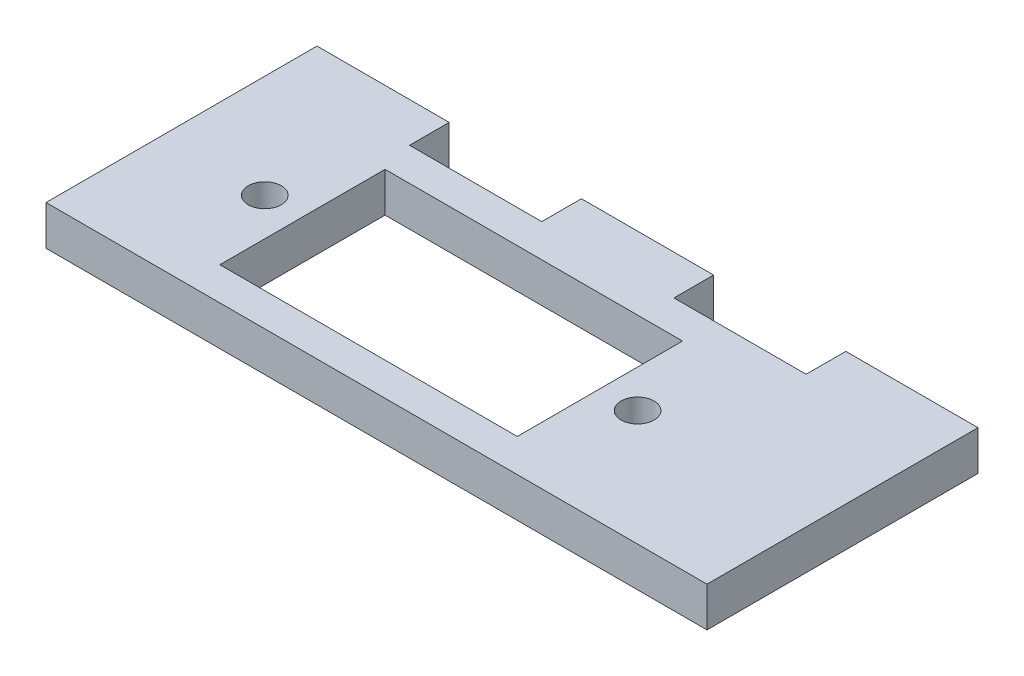
ISO-10303-21;
HEADER;
FILE_DESCRIPTION(('STEP AP214'),'2;1');
FILE_NAME('part.step','',(''),(''),'','','');
FILE_SCHEMA(('AUTOMOTIVE_DESIGN { 1 0 10303 214 1 1 1 1 }'));
ENDSEC;
DATA;
#1=APPLICATION_CONTEXT('core data for automotive mechanical design processes');
#2=APPLICATION_PROTOCOL_DEFINITION('international standard','automotive_design',2000,#1);
#3=PRODUCT_CONTEXT('',#1,'mechanical');
#4=PRODUCT('Part','Part','',(#3));
#5=PRODUCT_RELATED_PRODUCT_CATEGORY('part','',(#4));
#6=PRODUCT_DEFINITION_FORMATION('','',#4);
#7=PRODUCT_DEFINITION_CONTEXT('part definition',#1,'design');
#8=PRODUCT_DEFINITION('design','',#6,#7);
#9=PRODUCT_DEFINITION_SHAPE('','',#8);
#10=(LENGTH_UNIT() NAMED_UNIT(*) SI_UNIT(.MILLI.,.METRE.));
#11=(NAMED_UNIT(*) PLANE_ANGLE_UNIT() SI_UNIT($,.RADIAN.));
#12=(NAMED_UNIT(*) SI_UNIT($,.STERADIAN.) SOLID_ANGLE_UNIT());
#13=UNCERTAINTY_MEASURE_WITH_UNIT(LENGTH_MEASURE(1.E-05),#10,'distance_accuracy_value','');
#14=(GEOMETRIC_REPRESENTATION_CONTEXT(3) GLOBAL_UNCERTAINTY_ASSIGNED_CONTEXT((#13)) GLOBAL_UNIT_ASSIGNED_CONTEXT((#10,
#11,#12)) REPRESENTATION_CONTEXT('',''));
#15=CARTESIAN_POINT('',(0.,0.,0.));
#16=DIRECTION('',(0.,0.,1.));
#17=DIRECTION('',(1.,0.,0.));
#18=AXIS2_PLACEMENT_3D('',#15,#16,#17);
#19=CARTESIAN_POINT('',(8.14999999999999,3.,0.));
#20=DIRECTION('',(1.,0.,0.));
#21=DIRECTION('',(0.,0.,-1.));
#22=AXIS2_PLACEMENT_3D('',#19,#20,#21);
#23=PLANE('',#22);
#24=DIRECTION('',(0.,0.,1.));
#25=VECTOR('',#24,1.);
#26=CARTESIAN_POINT('',(8.14999999999999,0.,0.));
#27=LINE('',#26,#25);
#28=CARTESIAN_POINT('',(8.14999999999999,0.,-6.25));
#29=VERTEX_POINT('',#28);
#30=CARTESIAN_POINT('',(8.14999999999999,0.,6.25));
#31=VERTEX_POINT('',#30);
#32=EDGE_CURVE('E277',#29,#31,#27,.T.);
#33=ORIENTED_EDGE('',*,*,#32,.T.);
#34=DIRECTION('',(0.,-1.,0.));
#35=VECTOR('',#34,1.);
#36=CARTESIAN_POINT('',(8.14999999999999,3.,6.25));
#37=LINE('',#36,#35);
#38=CARTESIAN_POINT('',(8.14999999999999,3.,6.25));
#39=VERTEX_POINT('',#38);
#40=EDGE_CURVE('E257',#39,#31,#37,.T.);
#41=ORIENTED_EDGE('',*,*,#40,.F.);
#42=DIRECTION('',(0.,0.,1.));
#43=VECTOR('',#42,1.);
#44=CARTESIAN_POINT('',(8.14999999999999,3.,0.));
#45=LINE('',#44,#43);
#46=CARTESIAN_POINT('',(8.14999999999999,3.,-6.25));
#47=VERTEX_POINT('',#46);
#48=EDGE_CURVE('E323',#47,#39,#45,.T.);
#49=ORIENTED_EDGE('',*,*,#48,.F.);
#50=DIRECTION('',(0.,-1.,0.));
#51=VECTOR('',#50,1.);
#52=CARTESIAN_POINT('',(8.14999999999999,3.,-6.25));
#53=LINE('',#52,#51);
#54=EDGE_CURVE('E228',#47,#29,#53,.T.);
#55=ORIENTED_EDGE('',*,*,#54,.T.);
#56=EDGE_LOOP('',(#33,#41,#49,#55));
#57=FACE_BOUND('',#56,.T.);
#58=ADVANCED_FACE('F117',(#57),#23,.F.);
#59=CARTESIAN_POINT('',(0.,3.,6.25));
#60=DIRECTION('',(0.,0.,-1.));
#61=DIRECTION('',(-1.,0.,0.));
#62=AXIS2_PLACEMENT_3D('',#59,#60,#61);
#63=PLANE('',#62);
#64=DIRECTION('',(1.,0.,0.));
#65=VECTOR('',#64,1.);
#66=CARTESIAN_POINT('',(0.,0.,6.25));
#67=LINE('',#66,#65);
#68=CARTESIAN_POINT('',(-14.35,0.,6.25));
#69=VERTEX_POINT('',#68);
#70=EDGE_CURVE('E273',#69,#31,#67,.T.);
#71=ORIENTED_EDGE('',*,*,#70,.F.);
#72=DIRECTION('',(0.,-1.,0.));
#73=VECTOR('',#72,1.);
#74=CARTESIAN_POINT('',(-14.35,3.,6.25));
#75=LINE('',#74,#73);
#76=CARTESIAN_POINT('',(-14.35,3.,6.25));
#77=VERTEX_POINT('',#76);
#78=EDGE_CURVE('E261',#77,#69,#75,.T.);
#79=ORIENTED_EDGE('',*,*,#78,.F.);
#80=DIRECTION('',(1.,0.,0.));
#81=VECTOR('',#80,1.);
#82=CARTESIAN_POINT('',(0.,3.,6.25));
#83=LINE('',#82,#81);
#84=EDGE_CURVE('E319',#77,#39,#83,.T.);
#85=ORIENTED_EDGE('',*,*,#84,.T.);
#86=ORIENTED_EDGE('',*,*,#40,.T.);
#87=EDGE_LOOP('',(#71,#79,#85,#86));
#88=FACE_BOUND('',#87,.T.);
#89=ADVANCED_FACE('F487',(#88),#63,.T.);
#90=CARTESIAN_POINT('',(-14.35,3.,0.));
#91=DIRECTION('',(1.,0.,0.));
#92=DIRECTION('',(0.,0.,-1.));
#93=AXIS2_PLACEMENT_3D('',#90,#91,#92);
#94=PLANE('',#93);
#95=DIRECTION('',(0.,0.,1.));
#96=VECTOR('',#95,1.);
#97=CARTESIAN_POINT('',(-14.35,0.,0.));
#98=LINE('',#97,#96);
#99=CARTESIAN_POINT('',(-14.35,0.,-6.25));
#100=VERTEX_POINT('',#99);
#101=EDGE_CURVE('E268',#100,#69,#98,.T.);
#102=ORIENTED_EDGE('',*,*,#101,.F.);
#103=DIRECTION('',(0.,-1.,0.));
#104=VECTOR('',#103,1.);
#105=CARTESIAN_POINT('',(-14.35,3.,-6.25));
#106=LINE('',#105,#104);
#107=CARTESIAN_POINT('',(-14.35,3.,-6.25));
#108=VERTEX_POINT('',#107);
#109=EDGE_CURVE('E232',#108,#100,#106,.T.);
#110=ORIENTED_EDGE('',*,*,#109,.F.);
#111=DIRECTION('',(0.,0.,1.));
#112=VECTOR('',#111,1.);
#113=CARTESIAN_POINT('',(-14.35,3.,0.));
#114=LINE('',#113,#112);
#115=EDGE_CURVE('E253',#108,#77,#114,.T.);
#116=ORIENTED_EDGE('',*,*,#115,.T.);
#117=ORIENTED_EDGE('',*,*,#78,.T.);
#118=EDGE_LOOP('',(#102,#110,#116,#117));
#119=FACE_BOUND('',#118,.T.);
#120=ADVANCED_FACE('F492',(#119),#94,.T.);
#121=CARTESIAN_POINT('',(0.,3.,-6.25));
#122=DIRECTION('',(0.,0.,-1.));
#123=DIRECTION('',(-1.,0.,0.));
#124=AXIS2_PLACEMENT_3D('',#121,#122,#123);
#125=PLANE('',#124);
#126=DIRECTION('',(1.,0.,0.));
#127=VECTOR('',#126,1.);
#128=CARTESIAN_POINT('',(0.,0.,-6.25));
#129=LINE('',#128,#127);
#130=EDGE_CURVE('E281',#100,#29,#129,.T.);
#131=ORIENTED_EDGE('',*,*,#130,.T.);
#132=ORIENTED_EDGE('',*,*,#54,.F.);
#133=DIRECTION('',(1.,0.,0.));
#134=VECTOR('',#133,1.);
#135=CARTESIAN_POINT('',(0.,3.,-6.25));
#136=LINE('',#135,#134);
#137=EDGE_CURVE('E327',#108,#47,#136,.T.);
#138=ORIENTED_EDGE('',*,*,#137,.F.);
#139=ORIENTED_EDGE('',*,*,#109,.T.);
#140=EDGE_LOOP('',(#131,#132,#138,#139));
#141=FACE_BOUND('',#140,.T.);
#142=ADVANCED_FACE('F392',(#141),#125,.F.);
#143=CARTESIAN_POINT('',(25.,3.,0.));
#144=DIRECTION('',(-1.,0.,0.));
#145=DIRECTION('',(0.,0.,1.));
#146=AXIS2_PLACEMENT_3D('',#143,#144,#145);
#147=PLANE('',#146);
#148=DIRECTION('',(0.,0.,-1.));
#149=VECTOR('',#148,1.);
#150=CARTESIAN_POINT('',(25.,0.,0.));
#151=LINE('',#150,#149);
#152=CARTESIAN_POINT('',(25.,0.,8.75));
#153=VERTEX_POINT('',#152);
#154=CARTESIAN_POINT('',(25.,0.,-11.75));
#155=VERTEX_POINT('',#154);
#156=EDGE_CURVE('E166',#153,#155,#151,.T.);
#157=ORIENTED_EDGE('',*,*,#156,.T.);
#158=DIRECTION('',(0.,-1.,0.));
#159=VECTOR('',#158,1.);
#160=CARTESIAN_POINT('',(25.,3.,-11.75));
#161=LINE('',#160,#159);
#162=CARTESIAN_POINT('',(25.,3.,-11.75));
#163=VERTEX_POINT('',#162);
#164=EDGE_CURVE('E121',#163,#155,#161,.T.);
#165=ORIENTED_EDGE('',*,*,#164,.F.);
#166=DIRECTION('',(0.,0.,-1.));
#167=VECTOR('',#166,1.);
#168=CARTESIAN_POINT('',(25.,3.,0.));
#169=LINE('',#168,#167);
#170=CARTESIAN_POINT('',(25.,3.,8.75));
#171=VERTEX_POINT('',#170);
#172=EDGE_CURVE('E351',#171,#163,#169,.T.);
#173=ORIENTED_EDGE('',*,*,#172,.F.);
#174=DIRECTION('',(0.,-1.,0.));
#175=VECTOR('',#174,1.);
#176=CARTESIAN_POINT('',(25.,3.,8.75));
#177=LINE('',#176,#175);
#178=EDGE_CURVE('E229',#171,#153,#177,.T.);
#179=ORIENTED_EDGE('',*,*,#178,.T.);
#180=EDGE_LOOP('',(#157,#165,#173,#179));
#181=FACE_BOUND('',#180,.T.);
#182=ADVANCED_FACE('F418',(#181),#147,.F.);
#183=CARTESIAN_POINT('',(0.,3.,-8.75));
#184=DIRECTION('',(0.,0.,-1.));
#185=DIRECTION('',(-1.,0.,0.));
#186=AXIS2_PLACEMENT_3D('',#183,#184,#185);
#187=PLANE('',#186);
#188=DIRECTION('',(0.,1.,0.));
#189=VECTOR('',#188,1.);
#190=CARTESIAN_POINT('',(15.,3.,-8.75));
#191=LINE('',#190,#189);
#192=CARTESIAN_POINT('',(15.,0.,-8.75));
#193=VERTEX_POINT('',#192);
#194=CARTESIAN_POINT('',(15.,3.,-8.75));
#195=VERTEX_POINT('',#194);
#196=EDGE_CURVE('E12',#193,#195,#191,.T.);
#197=ORIENTED_EDGE('',*,*,#196,.F.);
#198=DIRECTION('',(1.,0.,0.));
#199=VECTOR('',#198,1.);
#200=CARTESIAN_POINT('',(0.,0.,-8.75));
#201=LINE('',#200,#199);
#202=CARTESIAN_POINT('',(5.00000000000001,0.,-8.75));
#203=VERTEX_POINT('',#202);
#204=EDGE_CURVE('E194',#203,#193,#201,.T.);
#205=ORIENTED_EDGE('',*,*,#204,.F.);
#206=DIRECTION('',(0.,-1.,0.));
#207=VECTOR('',#206,1.);
#208=CARTESIAN_POINT('',(5.00000000000001,3.,-8.75));
#209=LINE('',#208,#207);
#210=CARTESIAN_POINT('',(5.00000000000001,3.,-8.75));
#211=VERTEX_POINT('',#210);
#212=EDGE_CURVE('E233',#211,#203,#209,.T.);
#213=ORIENTED_EDGE('',*,*,#212,.F.);
#214=DIRECTION('',(1.,0.,0.));
#215=VECTOR('',#214,1.);
#216=CARTESIAN_POINT('',(0.,3.,-8.75));
#217=LINE('',#216,#215);
#218=EDGE_CURVE('E347',#211,#195,#217,.T.);
#219=ORIENTED_EDGE('',*,*,#218,.T.);
#220=EDGE_LOOP('',(#197,#205,#213,#219));
#221=FACE_BOUND('',#220,.T.);
#222=ADVANCED_FACE('F412',(#221),#187,.T.);
#223=CARTESIAN_POINT('',(5.,3.,0.));
#224=DIRECTION('',(-1.,0.,0.));
#225=DIRECTION('',(0.,0.,1.));
#226=AXIS2_PLACEMENT_3D('',#223,#224,#225);
#227=PLANE('',#226);
#228=DIRECTION('',(0.,0.,-1.));
#229=VECTOR('',#228,1.);
#230=CARTESIAN_POINT('',(5.,0.,0.));
#231=LINE('',#230,#229);
#232=CARTESIAN_POINT('',(5.00000000000001,0.,-11.75));
#233=VERTEX_POINT('',#232);
#234=EDGE_CURVE('E297',#203,#233,#231,.T.);
#235=ORIENTED_EDGE('',*,*,#234,.T.);
#236=DIRECTION('',(0.,-1.,0.));
#237=VECTOR('',#236,1.);
#238=CARTESIAN_POINT('',(5.00000000000001,3.,-11.75));
#239=LINE('',#238,#237);
#240=CARTESIAN_POINT('',(5.00000000000001,3.,-11.75));
#241=VERTEX_POINT('',#240);
#242=EDGE_CURVE('E237',#241,#233,#239,.T.);
#243=ORIENTED_EDGE('',*,*,#242,.F.);
#244=DIRECTION('',(0.,0.,-1.));
#245=VECTOR('',#244,1.);
#246=CARTESIAN_POINT('',(5.,3.,0.));
#247=LINE('',#246,#245);
#248=EDGE_CURVE('E343',#211,#241,#247,.T.);
#249=ORIENTED_EDGE('',*,*,#248,.F.);
#250=ORIENTED_EDGE('',*,*,#212,.T.);
#251=EDGE_LOOP('',(#235,#243,#249,#250));
#252=FACE_BOUND('',#251,.T.);
#253=ADVANCED_FACE('F460',(#252),#227,.F.);
#254=CARTESIAN_POINT('',(0.,3.,-11.75));
#255=DIRECTION('',(0.,0.,-1.));
#256=DIRECTION('',(-1.,0.,0.));
#257=AXIS2_PLACEMENT_3D('',#254,#255,#256);
#258=PLANE('',#257);
#259=DIRECTION('',(1.,0.,0.));
#260=VECTOR('',#259,1.);
#261=CARTESIAN_POINT('',(0.,0.,-11.75));
#262=LINE('',#261,#260);
#263=CARTESIAN_POINT('',(-4.99999999999999,0.,-11.75));
#264=VERTEX_POINT('',#263);
#265=EDGE_CURVE('E293',#264,#233,#262,.T.);
#266=ORIENTED_EDGE('',*,*,#265,.F.);
#267=DIRECTION('',(0.,-1.,0.));
#268=VECTOR('',#267,1.);
#269=CARTESIAN_POINT('',(-4.99999999999999,3.,-11.75));
#270=LINE('',#269,#268);
#271=CARTESIAN_POINT('',(-4.99999999999999,3.,-11.75));
#272=VERTEX_POINT('',#271);
#273=EDGE_CURVE('E241',#272,#264,#270,.T.);
#274=ORIENTED_EDGE('',*,*,#273,.F.);
#275=DIRECTION('',(1.,0.,0.));
#276=VECTOR('',#275,1.);
#277=CARTESIAN_POINT('',(0.,3.,-11.75));
#278=LINE('',#277,#276);
#279=EDGE_CURVE('E339',#272,#241,#278,.T.);
#280=ORIENTED_EDGE('',*,*,#279,.T.);
#281=ORIENTED_EDGE('',*,*,#242,.T.);
#282=EDGE_LOOP('',(#266,#274,#280,#281));
#283=FACE_BOUND('',#282,.T.);
#284=ADVANCED_FACE('F439',(#283),#258,.T.);
#285=CARTESIAN_POINT('',(-4.99999999999999,3.,0.));
#286=DIRECTION('',(-1.,0.,0.));
#287=DIRECTION('',(0.,0.,1.));
#288=AXIS2_PLACEMENT_3D('',#285,#286,#287);
#289=PLANE('',#288);
#290=DIRECTION('',(0.,0.,-1.));
#291=VECTOR('',#290,1.);
#292=CARTESIAN_POINT('',(-4.99999999999999,0.,0.));
#293=LINE('',#292,#291);
#294=CARTESIAN_POINT('',(-4.99999999999999,0.,-8.75));
#295=VERTEX_POINT('',#294);
#296=EDGE_CURVE('E289',#295,#264,#293,.T.);
#297=ORIENTED_EDGE('',*,*,#296,.F.);
#298=DIRECTION('',(0.,-1.,0.));
#299=VECTOR('',#298,1.);
#300=CARTESIAN_POINT('',(-4.99999999999999,3.,-8.75));
#301=LINE('',#300,#299);
#302=CARTESIAN_POINT('',(-4.99999999999999,3.,-8.75));
#303=VERTEX_POINT('',#302);
#304=EDGE_CURVE('E245',#303,#295,#301,.T.);
#305=ORIENTED_EDGE('',*,*,#304,.F.);
#306=DIRECTION('',(0.,0.,-1.));
#307=VECTOR('',#306,1.);
#308=CARTESIAN_POINT('',(-4.99999999999999,3.,0.));
#309=LINE('',#308,#307);
#310=EDGE_CURVE('E335',#303,#272,#309,.T.);
#311=ORIENTED_EDGE('',*,*,#310,.T.);
#312=ORIENTED_EDGE('',*,*,#273,.T.);
#313=EDGE_LOOP('',(#297,#305,#311,#312));
#314=FACE_BOUND('',#313,.T.);
#315=ADVANCED_FACE('F431',(#314),#289,.T.);
#316=CARTESIAN_POINT('',(-15.,0.,-8.75));
#317=VERTEX_POINT('',#316);
#318=EDGE_CURVE('E288',#317,#295,#201,.T.);
#319=ORIENTED_EDGE('',*,*,#318,.F.);
#320=DIRECTION('',(0.,1.,0.));
#321=VECTOR('',#320,1.);
#322=CARTESIAN_POINT('',(-15.,3.,-8.75));
#323=LINE('',#322,#321);
#324=CARTESIAN_POINT('',(-15.,3.,-8.75));
#325=VERTEX_POINT('',#324);
#326=EDGE_CURVE('E128',#317,#325,#323,.T.);
#327=ORIENTED_EDGE('',*,*,#326,.T.);
#328=EDGE_CURVE('E334',#325,#303,#217,.T.);
#329=ORIENTED_EDGE('',*,*,#328,.T.);
#330=ORIENTED_EDGE('',*,*,#304,.T.);
#331=EDGE_LOOP('',(#319,#327,#329,#330));
#332=FACE_BOUND('',#331,.T.);
#333=ADVANCED_FACE('F426',(#332),#187,.T.);
#334=CARTESIAN_POINT('',(-25.,3.,0.));
#335=DIRECTION('',(-1.,0.,0.));
#336=DIRECTION('',(0.,0.,1.));
#337=AXIS2_PLACEMENT_3D('',#334,#335,#336);
#338=PLANE('',#337);
#339=DIRECTION('',(0.,0.,-1.));
#340=VECTOR('',#339,1.);
#341=CARTESIAN_POINT('',(-25.,0.,0.));
#342=LINE('',#341,#340);
#343=CARTESIAN_POINT('',(-25.,0.,8.75));
#344=VERTEX_POINT('',#343);
#345=CARTESIAN_POINT('',(-25.,0.,-11.75));
#346=VERTEX_POINT('',#345);
#347=EDGE_CURVE('E285',#344,#346,#342,.T.);
#348=ORIENTED_EDGE('',*,*,#347,.F.);
#349=DIRECTION('',(0.,-1.,0.));
#350=VECTOR('',#349,1.);
#351=CARTESIAN_POINT('',(-25.,3.,8.75));
#352=LINE('',#351,#350);
#353=CARTESIAN_POINT('',(-25.,3.,8.75));
#354=VERTEX_POINT('',#353);
#355=EDGE_CURVE('E249',#354,#344,#352,.T.);
#356=ORIENTED_EDGE('',*,*,#355,.F.);
#357=DIRECTION('',(0.,0.,-1.));
#358=VECTOR('',#357,1.);
#359=CARTESIAN_POINT('',(-25.,3.,0.));
#360=LINE('',#359,#358);
#361=CARTESIAN_POINT('',(-25.,3.,-11.75));
#362=VERTEX_POINT('',#361);
#363=EDGE_CURVE('E331',#354,#362,#360,.T.);
#364=ORIENTED_EDGE('',*,*,#363,.T.);
#365=DIRECTION('',(0.,-1.,0.));
#366=VECTOR('',#365,1.);
#367=CARTESIAN_POINT('',(-25.,3.,-11.75));
#368=LINE('',#367,#366);
#369=EDGE_CURVE('E206',#362,#346,#368,.T.);
#370=ORIENTED_EDGE('',*,*,#369,.T.);
#371=EDGE_LOOP('',(#348,#356,#364,#370));
#372=FACE_BOUND('',#371,.T.);
#373=ADVANCED_FACE('F472',(#372),#338,.T.);
#374=CARTESIAN_POINT('',(0.,3.,8.75));
#375=DIRECTION('',(0.,0.,-1.));
#376=DIRECTION('',(-1.,0.,0.));
#377=AXIS2_PLACEMENT_3D('',#374,#375,#376);
#378=PLANE('',#377);
#379=DIRECTION('',(1.,0.,0.));
#380=VECTOR('',#379,1.);
#381=CARTESIAN_POINT('',(0.,0.,8.75));
#382=LINE('',#381,#380);
#383=EDGE_CURVE('E305',#344,#153,#382,.T.);
#384=ORIENTED_EDGE('',*,*,#383,.T.);
#385=ORIENTED_EDGE('',*,*,#178,.F.);
#386=DIRECTION('',(1.,0.,0.));
#387=VECTOR('',#386,1.);
#388=CARTESIAN_POINT('',(0.,3.,8.75));
#389=LINE('',#388,#387);
#390=EDGE_CURVE('E354',#354,#171,#389,.T.);
#391=ORIENTED_EDGE('',*,*,#390,.F.);
#392=ORIENTED_EDGE('',*,*,#355,.T.);
#393=EDGE_LOOP('',(#384,#385,#391,#392));
#394=FACE_BOUND('',#393,.T.);
#395=ADVANCED_FACE('F474',(#394),#378,.F.);
#396=CARTESIAN_POINT('',(11.,3.,0.));
#397=DIRECTION('',(0.,-1.,0.));
#398=DIRECTION('',(0.,0.,-1.));
#399=AXIS2_PLACEMENT_3D('',#396,#397,#398);
#400=CYLINDRICAL_SURFACE('',#399,1.25);
#401=CARTESIAN_POINT('',(11.,3.,0.));
#402=DIRECTION('',(0.,1.,0.));
#403=DIRECTION('',(0.,0.,1.));
#404=AXIS2_PLACEMENT_3D('',#401,#402,#403);
#405=CIRCLE('',#404,1.25);
#406=CARTESIAN_POINT('',(11.,3.,1.25));
#407=VERTEX_POINT('',#406);
#408=EDGE_CURVE('E358',#407,#407,#405,.T.);
#409=ORIENTED_EDGE('',*,*,#408,.T.);
#410=EDGE_LOOP('',(#409));
#411=FACE_BOUND('',#410,.T.);
#412=CARTESIAN_POINT('',(11.,0.,0.));
#413=DIRECTION('',(0.,1.,0.));
#414=DIRECTION('',(0.,0.,1.));
#415=AXIS2_PLACEMENT_3D('',#412,#413,#414);
#416=CIRCLE('',#415,1.25);
#417=CARTESIAN_POINT('',(11.,0.,1.25));
#418=VERTEX_POINT('',#417);
#419=EDGE_CURVE('E309',#418,#418,#416,.T.);
#420=ORIENTED_EDGE('',*,*,#419,.F.);
#421=EDGE_LOOP('',(#420));
#422=FACE_BOUND('',#421,.T.);
#423=ADVANCED_FACE('F476',(#411,#422),#400,.F.);
#424=CARTESIAN_POINT('',(-17.2,3.,0.));
#425=DIRECTION('',(0.,-1.,0.));
#426=DIRECTION('',(0.,0.,-1.));
#427=AXIS2_PLACEMENT_3D('',#424,#425,#426);
#428=CYLINDRICAL_SURFACE('',#427,1.25);
#429=CARTESIAN_POINT('',(-17.2,3.,0.));
#430=DIRECTION('',(0.,1.,0.));
#431=DIRECTION('',(0.,0.,1.));
#432=AXIS2_PLACEMENT_3D('',#429,#430,#431);
#433=CIRCLE('',#432,1.25);
#434=CARTESIAN_POINT('',(-17.2,3.,1.25));
#435=VERTEX_POINT('',#434);
#436=EDGE_CURVE('E272',#435,#435,#433,.T.);
#437=ORIENTED_EDGE('',*,*,#436,.T.);
#438=EDGE_LOOP('',(#437));
#439=FACE_BOUND('',#438,.T.);
#440=CARTESIAN_POINT('',(-17.2,0.,0.));
#441=DIRECTION('',(0.,1.,0.));
#442=DIRECTION('',(0.,0.,1.));
#443=AXIS2_PLACEMENT_3D('',#440,#441,#442);
#444=CIRCLE('',#443,1.25);
#445=CARTESIAN_POINT('',(-17.2,0.,1.25));
#446=VERTEX_POINT('',#445);
#447=EDGE_CURVE('E211',#446,#446,#444,.T.);
#448=ORIENTED_EDGE('',*,*,#447,.F.);
#449=EDGE_LOOP('',(#448));
#450=FACE_BOUND('',#449,.T.);
#451=ADVANCED_FACE('F366',(#439,#450),#428,.F.);
#452=CARTESIAN_POINT('',(0.,0.,0.));
#453=DIRECTION('',(0.,1.,0.));
#454=DIRECTION('',(0.,0.,1.));
#455=AXIS2_PLACEMENT_3D('',#452,#453,#454);
#456=PLANE('',#455);
#457=ORIENTED_EDGE('',*,*,#447,.T.);
#458=EDGE_LOOP('',(#457));
#459=FACE_BOUND('',#458,.T.);
#460=ORIENTED_EDGE('',*,*,#419,.T.);
#461=EDGE_LOOP('',(#460));
#462=FACE_BOUND('',#461,.T.);
#463=ORIENTED_EDGE('',*,*,#383,.F.);
#464=ORIENTED_EDGE('',*,*,#347,.T.);
#465=DIRECTION('',(1.,0.,0.));
#466=VECTOR('',#465,1.);
#467=CARTESIAN_POINT('',(-25.,0.,-11.75));
#468=LINE('',#467,#466);
#469=CARTESIAN_POINT('',(-15.,0.,-11.75));
#470=VERTEX_POINT('',#469);
#471=EDGE_CURVE('E217',#346,#470,#468,.T.);
#472=ORIENTED_EDGE('',*,*,#471,.T.);
#473=DIRECTION('',(0.,0.,-1.));
#474=VECTOR('',#473,1.);
#475=CARTESIAN_POINT('',(-15.,0.,-8.75));
#476=LINE('',#475,#474);
#477=EDGE_CURVE('E212',#317,#470,#476,.T.);
#478=ORIENTED_EDGE('',*,*,#477,.F.);
#479=ORIENTED_EDGE('',*,*,#318,.T.);
#480=ORIENTED_EDGE('',*,*,#296,.T.);
#481=ORIENTED_EDGE('',*,*,#265,.T.);
#482=ORIENTED_EDGE('',*,*,#234,.F.);
#483=ORIENTED_EDGE('',*,*,#204,.T.);
#484=DIRECTION('',(0.,0.,-1.));
#485=VECTOR('',#484,1.);
#486=CARTESIAN_POINT('',(15.,0.,-8.75));
#487=LINE('',#486,#485);
#488=CARTESIAN_POINT('',(15.,0.,-11.75));
#489=VERTEX_POINT('',#488);
#490=EDGE_CURVE('E176',#193,#489,#487,.T.);
#491=ORIENTED_EDGE('',*,*,#490,.T.);
#492=DIRECTION('',(1.,0.,0.));
#493=VECTOR('',#492,1.);
#494=CARTESIAN_POINT('',(15.,0.,-11.75));
#495=LINE('',#494,#493);
#496=EDGE_CURVE('E185',#489,#155,#495,.T.);
#497=ORIENTED_EDGE('',*,*,#496,.T.);
#498=ORIENTED_EDGE('',*,*,#156,.F.);
#499=EDGE_LOOP('',(#463,#464,#472,#478,#479,#480,#481,#482,#483,#491,#497,#498));
#500=FACE_BOUND('',#499,.T.);
#501=ORIENTED_EDGE('',*,*,#130,.F.);
#502=ORIENTED_EDGE('',*,*,#101,.T.);
#503=ORIENTED_EDGE('',*,*,#70,.T.);
#504=ORIENTED_EDGE('',*,*,#32,.F.);
#505=EDGE_LOOP('',(#501,#502,#503,#504));
#506=FACE_BOUND('',#505,.T.);
#507=ADVANCED_FACE('F190',(#459,#462,#500,#506),#456,.F.);
#508=CARTESIAN_POINT('',(0.,3.,0.));
#509=DIRECTION('',(0.,1.,0.));
#510=DIRECTION('',(0.,0.,1.));
#511=AXIS2_PLACEMENT_3D('',#508,#509,#510);
#512=PLANE('',#511);
#513=ORIENTED_EDGE('',*,*,#436,.F.);
#514=EDGE_LOOP('',(#513));
#515=FACE_BOUND('',#514,.T.);
#516=ORIENTED_EDGE('',*,*,#408,.F.);
#517=EDGE_LOOP('',(#516));
#518=FACE_BOUND('',#517,.T.);
#519=ORIENTED_EDGE('',*,*,#390,.T.);
#520=ORIENTED_EDGE('',*,*,#172,.T.);
#521=DIRECTION('',(1.,0.,0.));
#522=VECTOR('',#521,1.);
#523=CARTESIAN_POINT('',(15.,3.,-11.75));
#524=LINE('',#523,#522);
#525=CARTESIAN_POINT('',(15.,3.,-11.75));
#526=VERTEX_POINT('',#525);
#527=EDGE_CURVE('E196',#526,#163,#524,.T.);
#528=ORIENTED_EDGE('',*,*,#527,.F.);
#529=DIRECTION('',(0.,0.,-1.));
#530=VECTOR('',#529,1.);
#531=CARTESIAN_POINT('',(15.,3.,-8.75));
#532=LINE('',#531,#530);
#533=EDGE_CURVE('E179',#195,#526,#532,.T.);
#534=ORIENTED_EDGE('',*,*,#533,.F.);
#535=ORIENTED_EDGE('',*,*,#218,.F.);
#536=ORIENTED_EDGE('',*,*,#248,.T.);
#537=ORIENTED_EDGE('',*,*,#279,.F.);
#538=ORIENTED_EDGE('',*,*,#310,.F.);
#539=ORIENTED_EDGE('',*,*,#328,.F.);
#540=DIRECTION('',(0.,0.,-1.));
#541=VECTOR('',#540,1.);
#542=CARTESIAN_POINT('',(-15.,3.,-8.75));
#543=LINE('',#542,#541);
#544=CARTESIAN_POINT('',(-15.,3.,-11.75));
#545=VERTEX_POINT('',#544);
#546=EDGE_CURVE('E207',#325,#545,#543,.T.);
#547=ORIENTED_EDGE('',*,*,#546,.T.);
#548=DIRECTION('',(1.,0.,0.));
#549=VECTOR('',#548,1.);
#550=CARTESIAN_POINT('',(-25.,3.,-11.75));
#551=LINE('',#550,#549);
#552=EDGE_CURVE('E216',#362,#545,#551,.T.);
#553=ORIENTED_EDGE('',*,*,#552,.F.);
#554=ORIENTED_EDGE('',*,*,#363,.F.);
#555=EDGE_LOOP('',(#519,#520,#528,#534,#535,#536,#537,#538,#539,#547,#553,#554));
#556=FACE_BOUND('',#555,.T.);
#557=ORIENTED_EDGE('',*,*,#137,.T.);
#558=ORIENTED_EDGE('',*,*,#48,.T.);
#559=ORIENTED_EDGE('',*,*,#84,.F.);
#560=ORIENTED_EDGE('',*,*,#115,.F.);
#561=EDGE_LOOP('',(#557,#558,#559,#560));
#562=FACE_BOUND('',#561,.T.);
#563=ADVANCED_FACE('F369',(#515,#518,#556,#562),#512,.T.);
#564=CARTESIAN_POINT('',(15.,3.,-11.75));
#565=DIRECTION('',(0.,0.,-1.));
#566=DIRECTION('',(-1.,0.,0.));
#567=AXIS2_PLACEMENT_3D('',#564,#565,#566);
#568=PLANE('',#567);
#569=ORIENTED_EDGE('',*,*,#496,.F.);
#570=DIRECTION('',(0.,-1.,0.));
#571=VECTOR('',#570,1.);
#572=CARTESIAN_POINT('',(15.,3.,-11.75));
#573=LINE('',#572,#571);
#574=EDGE_CURVE('E172',#526,#489,#573,.T.);
#575=ORIENTED_EDGE('',*,*,#574,.F.);
#576=ORIENTED_EDGE('',*,*,#527,.T.);
#577=ORIENTED_EDGE('',*,*,#164,.T.);
#578=EDGE_LOOP('',(#569,#575,#576,#577));
#579=FACE_BOUND('',#578,.T.);
#580=ADVANCED_FACE('F119',(#579),#568,.T.);
#581=CARTESIAN_POINT('',(15.,3.,-8.75));
#582=DIRECTION('',(-1.,0.,0.));
#583=DIRECTION('',(0.,0.,1.));
#584=AXIS2_PLACEMENT_3D('',#581,#582,#583);
#585=PLANE('',#584);
#586=ORIENTED_EDGE('',*,*,#490,.F.);
#587=ORIENTED_EDGE('',*,*,#196,.T.);
#588=ORIENTED_EDGE('',*,*,#533,.T.);
#589=ORIENTED_EDGE('',*,*,#574,.T.);
#590=EDGE_LOOP('',(#586,#587,#588,#589));
#591=FACE_BOUND('',#590,.T.);
#592=ADVANCED_FACE('F174',(#591),#585,.T.);
#593=CARTESIAN_POINT('',(-15.,3.,-8.75));
#594=DIRECTION('',(-1.,0.,0.));
#595=DIRECTION('',(0.,0.,1.));
#596=AXIS2_PLACEMENT_3D('',#593,#594,#595);
#597=PLANE('',#596);
#598=ORIENTED_EDGE('',*,*,#477,.T.);
#599=DIRECTION('',(0.,-1.,0.));
#600=VECTOR('',#599,1.);
#601=CARTESIAN_POINT('',(-15.,3.,-11.75));
#602=LINE('',#601,#600);
#603=EDGE_CURVE('E203',#545,#470,#602,.T.);
#604=ORIENTED_EDGE('',*,*,#603,.F.);
#605=ORIENTED_EDGE('',*,*,#546,.F.);
#606=ORIENTED_EDGE('',*,*,#326,.F.);
#607=EDGE_LOOP('',(#598,#604,#605,#606));
#608=FACE_BOUND('',#607,.T.);
#609=ADVANCED_FACE('F465',(#608),#597,.F.);
#610=CARTESIAN_POINT('',(-25.,3.,-11.75));
#611=DIRECTION('',(0.,0.,-1.));
#612=DIRECTION('',(-1.,0.,0.));
#613=AXIS2_PLACEMENT_3D('',#610,#611,#612);
#614=PLANE('',#613);
#615=ORIENTED_EDGE('',*,*,#471,.F.);
#616=ORIENTED_EDGE('',*,*,#369,.F.);
#617=ORIENTED_EDGE('',*,*,#552,.T.);
#618=ORIENTED_EDGE('',*,*,#603,.T.);
#619=EDGE_LOOP('',(#615,#616,#617,#618));
#620=FACE_BOUND('',#619,.T.);
#621=ADVANCED_FACE('F469',(#620),#614,.T.);
#622=CLOSED_SHELL('',(#58,#89,#120,#142,#182,#222,#253,#284,#315,#333,#373,#395,#423,#451,#507,
#563,#580,#592,#609,#621));
#623=MANIFOLD_SOLID_BREP('B2',#622);
#624=ADVANCED_BREP_SHAPE_REPRESENTATION('',(#18,#623),#14);
#625=SHAPE_DEFINITION_REPRESENTATION(#9,#624);
ENDSEC;
END-ISO-10303-21;
